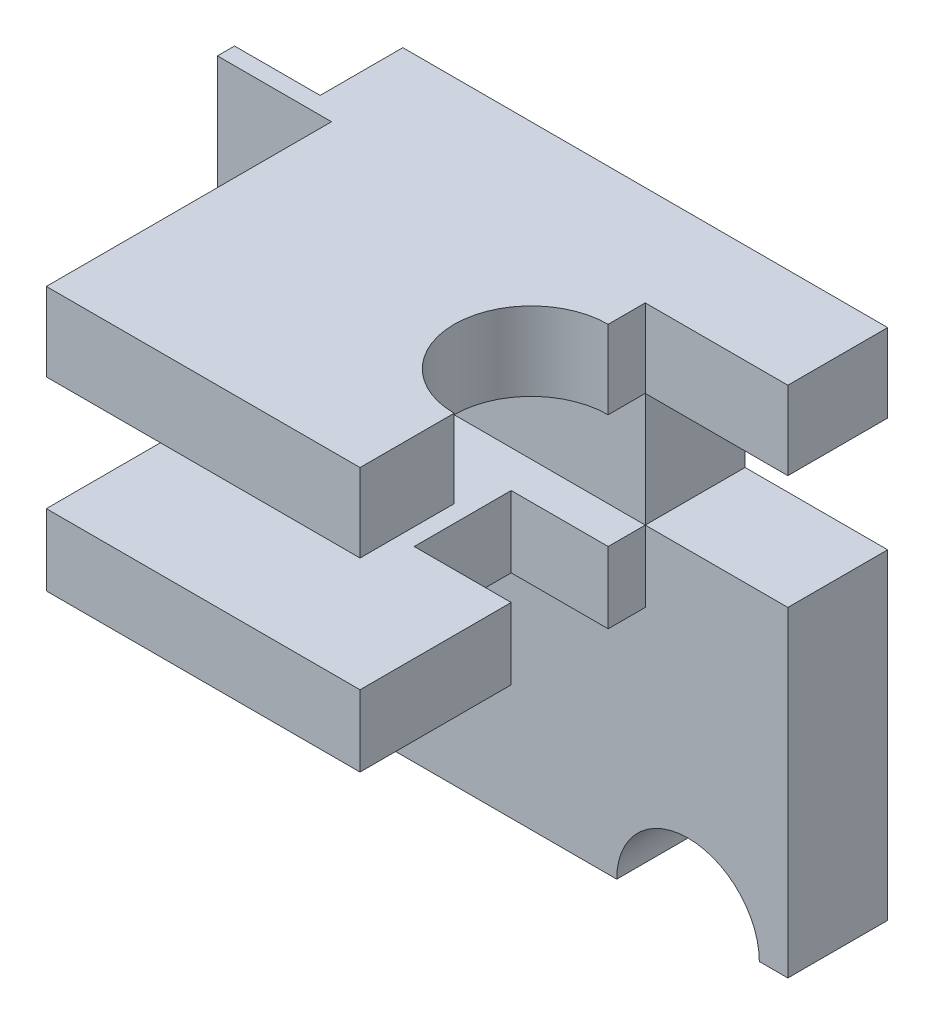
ISO-10303-21;
HEADER;
FILE_DESCRIPTION(('STEP AP214'),'2;1');
FILE_NAME('part.step','',(''),(''),'','','');
FILE_SCHEMA(('AUTOMOTIVE_DESIGN { 1 0 10303 214 1 1 1 1 }'));
ENDSEC;
DATA;
#1=APPLICATION_CONTEXT('core data for automotive mechanical design processes');
#2=APPLICATION_PROTOCOL_DEFINITION('international standard','automotive_design',2000,#1);
#3=PRODUCT_CONTEXT('',#1,'mechanical');
#4=PRODUCT('Part','Part','',(#3));
#5=PRODUCT_RELATED_PRODUCT_CATEGORY('part','',(#4));
#6=PRODUCT_DEFINITION_FORMATION('','',#4);
#7=PRODUCT_DEFINITION_CONTEXT('part definition',#1,'design');
#8=PRODUCT_DEFINITION('design','',#6,#7);
#9=PRODUCT_DEFINITION_SHAPE('','',#8);
#10=(LENGTH_UNIT() NAMED_UNIT(*) SI_UNIT(.MILLI.,.METRE.));
#11=(NAMED_UNIT(*) PLANE_ANGLE_UNIT() SI_UNIT($,.RADIAN.));
#12=(NAMED_UNIT(*) SI_UNIT($,.STERADIAN.) SOLID_ANGLE_UNIT());
#13=UNCERTAINTY_MEASURE_WITH_UNIT(LENGTH_MEASURE(1.E-05),#10,'distance_accuracy_value','');
#14=(GEOMETRIC_REPRESENTATION_CONTEXT(3) GLOBAL_UNCERTAINTY_ASSIGNED_CONTEXT((#13)) GLOBAL_UNIT_ASSIGNED_CONTEXT((#10,
#11,#12)) REPRESENTATION_CONTEXT('',''));
#15=CARTESIAN_POINT('',(0.,0.,0.));
#16=DIRECTION('',(0.,0.,1.));
#17=DIRECTION('',(1.,0.,0.));
#18=AXIS2_PLACEMENT_3D('',#15,#16,#17);
#19=CARTESIAN_POINT('',(50.,-2.47474172210313,35.));
#20=DIRECTION('',(-1.,0.,0.));
#21=DIRECTION('',(0.,0.,1.));
#22=AXIS2_PLACEMENT_3D('',#19,#20,#21);
#23=PLANE('',#22);
#24=DIRECTION('',(0.,0.,1.));
#25=VECTOR('',#24,1.);
#26=CARTESIAN_POINT('',(50.,22.5252582778969,35.));
#27=LINE('',#26,#25);
#28=CARTESIAN_POINT('',(50.,22.5252582778969,35.));
#29=VERTEX_POINT('',#28);
#30=CARTESIAN_POINT('',(50.,22.5252582778969,48.));
#31=VERTEX_POINT('',#30);
#32=EDGE_CURVE('E258',#29,#31,#27,.T.);
#33=ORIENTED_EDGE('',*,*,#32,.T.);
#34=DIRECTION('',(0.,-1.,0.));
#35=VECTOR('',#34,1.);
#36=CARTESIAN_POINT('',(50.,70.6085193985821,48.));
#37=LINE('',#36,#35);
#38=CARTESIAN_POINT('',(50.,-2.47474172210313,48.));
#39=VERTEX_POINT('',#38);
#40=EDGE_CURVE('E580',#31,#39,#37,.T.);
#41=ORIENTED_EDGE('',*,*,#40,.T.);
#42=DIRECTION('',(0.,0.,1.));
#43=VECTOR('',#42,1.);
#44=CARTESIAN_POINT('',(50.,-2.47474172210313,35.));
#45=LINE('',#44,#43);
#46=CARTESIAN_POINT('',(50.,-2.47474172210313,35.));
#47=VERTEX_POINT('',#46);
#48=EDGE_CURVE('E234',#47,#39,#45,.T.);
#49=ORIENTED_EDGE('',*,*,#48,.F.);
#50=DIRECTION('',(0.,1.,0.));
#51=VECTOR('',#50,1.);
#52=CARTESIAN_POINT('',(50.,-2.47474172210313,35.));
#53=LINE('',#52,#51);
#54=EDGE_CURVE('E276',#47,#29,#53,.T.);
#55=ORIENTED_EDGE('',*,*,#54,.T.);
#56=EDGE_LOOP('',(#33,#41,#49,#55));
#57=FACE_BOUND('',#56,.T.);
#58=ADVANCED_FACE('F39',(#57),#23,.F.);
#59=CARTESIAN_POINT('',(50.,-86.1354291952882,35.));
#60=DIRECTION('',(-1.,0.,0.));
#61=DIRECTION('',(0.,0.,1.));
#62=AXIS2_PLACEMENT_3D('',#59,#60,#61);
#63=PLANE('',#62);
#64=DIRECTION('',(0.,0.,1.));
#65=VECTOR('',#64,1.);
#66=CARTESIAN_POINT('',(50.,62.5252582778969,35.));
#67=LINE('',#66,#65);
#68=CARTESIAN_POINT('',(50.,62.5252582778969,102.));
#69=VERTEX_POINT('',#68);
#70=CARTESIAN_POINT('',(50.,62.5252582778969,135.));
#71=VERTEX_POINT('',#70);
#72=EDGE_CURVE('E289',#69,#71,#67,.T.);
#73=ORIENTED_EDGE('',*,*,#72,.F.);
#74=DIRECTION('',(0.,1.,0.));
#75=VECTOR('',#74,1.);
#76=CARTESIAN_POINT('',(50.,2.15142288540256,102.));
#77=LINE('',#76,#75);
#78=CARTESIAN_POINT('',(50.,90.,102.));
#79=VERTEX_POINT('',#78);
#80=EDGE_CURVE('E65',#69,#79,#77,.T.);
#81=ORIENTED_EDGE('',*,*,#80,.T.);
#82=DIRECTION('',(0.,0.,1.));
#83=VECTOR('',#82,1.);
#84=CARTESIAN_POINT('',(50.,90.,35.));
#85=LINE('',#84,#83);
#86=CARTESIAN_POINT('',(50.,90.,135.));
#87=VERTEX_POINT('',#86);
#88=EDGE_CURVE('E285',#79,#87,#85,.T.);
#89=ORIENTED_EDGE('',*,*,#88,.T.);
#90=DIRECTION('',(0.,1.,0.));
#91=VECTOR('',#90,1.);
#92=CARTESIAN_POINT('',(50.,-86.1354291952882,135.));
#93=LINE('',#92,#91);
#94=EDGE_CURVE('E279',#71,#87,#93,.T.);
#95=ORIENTED_EDGE('',*,*,#94,.F.);
#96=EDGE_LOOP('',(#73,#81,#89,#95));
#97=FACE_BOUND('',#96,.T.);
#98=ADVANCED_FACE('F438',(#97),#63,.F.);
#99=CARTESIAN_POINT('',(0.,0.,35.));
#100=DIRECTION('',(0.,0.,1.));
#101=DIRECTION('',(1.,0.,0.));
#102=AXIS2_PLACEMENT_3D('',#99,#100,#101);
#103=PLANE('',#102);
#104=DIRECTION('',(1.,0.,0.));
#105=VECTOR('',#104,1.);
#106=CARTESIAN_POINT('',(100.,-2.47474172210312,35.));
#107=LINE('',#106,#105);
#108=CARTESIAN_POINT('',(-60.,-2.47474172210314,35.));
#109=VERTEX_POINT('',#108);
#110=EDGE_CURVE('E235',#109,#47,#107,.T.);
#111=ORIENTED_EDGE('',*,*,#110,.F.);
#112=DIRECTION('',(0.,1.,0.));
#113=VECTOR('',#112,1.);
#114=CARTESIAN_POINT('',(-60.,-2.47474172210314,35.));
#115=LINE('',#114,#113);
#116=CARTESIAN_POINT('',(-60.,22.5252582778969,35.));
#117=VERTEX_POINT('',#116);
#118=EDGE_CURVE('E251',#109,#117,#115,.T.);
#119=ORIENTED_EDGE('',*,*,#118,.T.);
#120=DIRECTION('',(1.,0.,0.));
#121=VECTOR('',#120,1.);
#122=CARTESIAN_POINT('',(100.,22.5252582778969,35.));
#123=LINE('',#122,#121);
#124=EDGE_CURVE('E252',#117,#29,#123,.T.);
#125=ORIENTED_EDGE('',*,*,#124,.T.);
#126=DIRECTION('',(0.,-1.,0.));
#127=VECTOR('',#126,1.);
#128=CARTESIAN_POINT('',(50.,62.5252582778969,35.));
#129=LINE('',#128,#127);
#130=CARTESIAN_POINT('',(50.,62.5252582778969,35.));
#131=VERTEX_POINT('',#130);
#132=EDGE_CURVE('E368',#131,#29,#129,.T.);
#133=ORIENTED_EDGE('',*,*,#132,.F.);
#134=DIRECTION('',(-1.,0.,0.));
#135=VECTOR('',#134,1.);
#136=CARTESIAN_POINT('',(50.,62.5252582778969,35.));
#137=LINE('',#136,#135);
#138=CARTESIAN_POINT('',(-60.,62.5252582778969,35.));
#139=VERTEX_POINT('',#138);
#140=EDGE_CURVE('E295',#131,#139,#137,.T.);
#141=ORIENTED_EDGE('',*,*,#140,.T.);
#142=DIRECTION('',(0.,1.,0.));
#143=VECTOR('',#142,1.);
#144=CARTESIAN_POINT('',(-60.,-86.1354291952882,35.));
#145=LINE('',#144,#143);
#146=CARTESIAN_POINT('',(-60.,90.,35.));
#147=VERTEX_POINT('',#146);
#148=EDGE_CURVE('E299',#139,#147,#145,.T.);
#149=ORIENTED_EDGE('',*,*,#148,.T.);
#150=DIRECTION('',(1.,0.,0.));
#151=VECTOR('',#150,1.);
#152=CARTESIAN_POINT('',(-100.,90.,35.));
#153=LINE('',#152,#151);
#154=CARTESIAN_POINT('',(-100.,90.,35.));
#155=VERTEX_POINT('',#154);
#156=EDGE_CURVE('E375',#155,#147,#153,.T.);
#157=ORIENTED_EDGE('',*,*,#156,.F.);
#158=DIRECTION('',(0.,1.,0.));
#159=VECTOR('',#158,1.);
#160=CARTESIAN_POINT('',(-100.,-90.,35.));
#161=LINE('',#160,#159);
#162=CARTESIAN_POINT('',(-100.,-90.,35.));
#163=VERTEX_POINT('',#162);
#164=EDGE_CURVE('E390',#163,#155,#161,.T.);
#165=ORIENTED_EDGE('',*,*,#164,.F.);
#166=DIRECTION('',(1.,0.,0.));
#167=VECTOR('',#166,1.);
#168=CARTESIAN_POINT('',(-100.,-90.,35.));
#169=LINE('',#168,#167);
#170=CARTESIAN_POINT('',(40.,-90.,35.));
#171=VERTEX_POINT('',#170);
#172=EDGE_CURVE('E386',#163,#171,#169,.T.);
#173=ORIENTED_EDGE('',*,*,#172,.T.);
#174=CARTESIAN_POINT('',(65.,-90.,35.));
#175=DIRECTION('',(0.,0.,1.));
#176=DIRECTION('',(1.,0.,0.));
#177=AXIS2_PLACEMENT_3D('',#174,#175,#176);
#178=CIRCLE('',#177,25.);
#179=CARTESIAN_POINT('',(90.,-90.,35.));
#180=VERTEX_POINT('',#179);
#181=EDGE_CURVE('E323',#171,#180,#178,.F.);
#182=ORIENTED_EDGE('',*,*,#181,.T.);
#183=CARTESIAN_POINT('',(100.,-90.,35.));
#184=VERTEX_POINT('',#183);
#185=EDGE_CURVE('E385',#180,#184,#169,.T.);
#186=ORIENTED_EDGE('',*,*,#185,.T.);
#187=DIRECTION('',(0.,1.,0.));
#188=VECTOR('',#187,1.);
#189=CARTESIAN_POINT('',(100.,-90.,35.));
#190=LINE('',#189,#188);
#191=CARTESIAN_POINT('',(100.,22.5252582778969,35.));
#192=VERTEX_POINT('',#191);
#193=EDGE_CURVE('E381',#184,#192,#190,.T.);
#194=ORIENTED_EDGE('',*,*,#193,.T.);
#195=DIRECTION('',(-1.,0.,0.));
#196=VECTOR('',#195,1.);
#197=CARTESIAN_POINT('',(100.,22.5252582778969,35.));
#198=LINE('',#197,#196);
#199=EDGE_CURVE('E358',#192,#29,#198,.T.);
#200=ORIENTED_EDGE('',*,*,#199,.T.);
#201=ORIENTED_EDGE('',*,*,#54,.F.);
#202=EDGE_LOOP('',(#111,#119,#125,#133,#141,#149,#157,#165,#173,#182,#186,#194,#200,#201));
#203=FACE_BOUND('',#202,.T.);
#204=ADVANCED_FACE('F450',(#203),#103,.T.);
#205=CARTESIAN_POINT('',(-100.,-90.,35.));
#206=DIRECTION('',(0.,1.,0.));
#207=DIRECTION('',(0.,0.,1.));
#208=AXIS2_PLACEMENT_3D('',#205,#206,#207);
#209=PLANE('',#208);
#210=ORIENTED_EDGE('',*,*,#185,.F.);
#211=DIRECTION('',(0.,0.,-1.));
#212=VECTOR('',#211,1.);
#213=CARTESIAN_POINT('',(90.,-90.,35.));
#214=LINE('',#213,#212);
#215=CARTESIAN_POINT('',(90.,-90.,0.));
#216=VERTEX_POINT('',#215);
#217=EDGE_CURVE('E327',#180,#216,#214,.T.);
#218=ORIENTED_EDGE('',*,*,#217,.T.);
#219=DIRECTION('',(1.,0.,0.));
#220=VECTOR('',#219,1.);
#221=CARTESIAN_POINT('',(-100.,-90.,0.));
#222=LINE('',#221,#220);
#223=CARTESIAN_POINT('',(100.,-90.,0.));
#224=VERTEX_POINT('',#223);
#225=EDGE_CURVE('E401',#216,#224,#222,.T.);
#226=ORIENTED_EDGE('',*,*,#225,.T.);
#227=DIRECTION('',(0.,0.,-1.));
#228=VECTOR('',#227,1.);
#229=CARTESIAN_POINT('',(100.,-90.,35.));
#230=LINE('',#229,#228);
#231=EDGE_CURVE('E407',#184,#224,#230,.T.);
#232=ORIENTED_EDGE('',*,*,#231,.F.);
#233=EDGE_LOOP('',(#210,#218,#226,#232));
#234=FACE_BOUND('',#233,.T.);
#235=ADVANCED_FACE('F527',(#234),#209,.F.);
#236=CARTESIAN_POINT('',(100.,-90.,35.));
#237=DIRECTION('',(-1.,0.,0.));
#238=DIRECTION('',(0.,0.,1.));
#239=AXIS2_PLACEMENT_3D('',#236,#237,#238);
#240=PLANE('',#239);
#241=DIRECTION('',(0.,0.,-1.));
#242=VECTOR('',#241,1.);
#243=CARTESIAN_POINT('',(100.,62.5252582778969,35.));
#244=LINE('',#243,#242);
#245=CARTESIAN_POINT('',(100.,62.5252582778969,35.));
#246=VERTEX_POINT('',#245);
#247=CARTESIAN_POINT('',(100.,62.5252582778969,0.));
#248=VERTEX_POINT('',#247);
#249=EDGE_CURVE('E307',#246,#248,#244,.T.);
#250=ORIENTED_EDGE('',*,*,#249,.T.);
#251=DIRECTION('',(0.,1.,0.));
#252=VECTOR('',#251,1.);
#253=CARTESIAN_POINT('',(100.,-90.,0.));
#254=LINE('',#253,#252);
#255=CARTESIAN_POINT('',(100.,90.,0.));
#256=VERTEX_POINT('',#255);
#257=EDGE_CURVE('E396',#248,#256,#254,.T.);
#258=ORIENTED_EDGE('',*,*,#257,.T.);
#259=DIRECTION('',(0.,0.,-1.));
#260=VECTOR('',#259,1.);
#261=CARTESIAN_POINT('',(100.,90.,35.));
#262=LINE('',#261,#260);
#263=CARTESIAN_POINT('',(100.,90.,35.));
#264=VERTEX_POINT('',#263);
#265=EDGE_CURVE('E43',#264,#256,#262,.T.);
#266=ORIENTED_EDGE('',*,*,#265,.F.);
#267=EDGE_CURVE('E379',#246,#264,#190,.T.);
#268=ORIENTED_EDGE('',*,*,#267,.F.);
#269=EDGE_LOOP('',(#250,#258,#266,#268));
#270=FACE_BOUND('',#269,.T.);
#271=ADVANCED_FACE('F427',(#270),#240,.F.);
#272=DIRECTION('',(0.,1.,0.));
#273=VECTOR('',#272,1.);
#274=CARTESIAN_POINT('',(50.,-86.1354291952882,35.));
#275=LINE('',#274,#273);
#276=CARTESIAN_POINT('',(50.,90.,35.));
#277=VERTEX_POINT('',#276);
#278=EDGE_CURVE('E317',#131,#277,#275,.T.);
#279=ORIENTED_EDGE('',*,*,#278,.F.);
#280=DIRECTION('',(-1.,0.,0.));
#281=VECTOR('',#280,1.);
#282=CARTESIAN_POINT('',(100.,62.5252582778969,35.));
#283=LINE('',#282,#281);
#284=EDGE_CURVE('E343',#246,#131,#283,.T.);
#285=ORIENTED_EDGE('',*,*,#284,.F.);
#286=ORIENTED_EDGE('',*,*,#267,.T.);
#287=EDGE_CURVE('E380',#277,#264,#153,.T.);
#288=ORIENTED_EDGE('',*,*,#287,.F.);
#289=EDGE_LOOP('',(#279,#285,#286,#288));
#290=FACE_BOUND('',#289,.T.);
#291=ADVANCED_FACE('F459',(#290),#103,.T.);
#292=CARTESIAN_POINT('',(0.,0.,0.));
#293=DIRECTION('',(0.,0.,1.));
#294=DIRECTION('',(1.,0.,0.));
#295=AXIS2_PLACEMENT_3D('',#292,#293,#294);
#296=PLANE('',#295);
#297=CARTESIAN_POINT('',(-70.,-90.,0.));
#298=VERTEX_POINT('',#297);
#299=CARTESIAN_POINT('',(40.,-90.,0.));
#300=VERTEX_POINT('',#299);
#301=EDGE_CURVE('E402',#298,#300,#222,.T.);
#302=ORIENTED_EDGE('',*,*,#301,.F.);
#303=DIRECTION('',(0.,1.,0.));
#304=VECTOR('',#303,1.);
#305=CARTESIAN_POINT('',(-70.,-90.,0.));
#306=LINE('',#305,#304);
#307=CARTESIAN_POINT('',(-70.,90.,0.));
#308=VERTEX_POINT('',#307);
#309=EDGE_CURVE('E257',#298,#308,#306,.T.);
#310=ORIENTED_EDGE('',*,*,#309,.T.);
#311=DIRECTION('',(1.,0.,0.));
#312=VECTOR('',#311,1.);
#313=CARTESIAN_POINT('',(-100.,90.,0.));
#314=LINE('',#313,#312);
#315=EDGE_CURVE('E339',#308,#256,#314,.T.);
#316=ORIENTED_EDGE('',*,*,#315,.T.);
#317=ORIENTED_EDGE('',*,*,#257,.F.);
#318=DIRECTION('',(-1.,0.,0.));
#319=VECTOR('',#318,1.);
#320=CARTESIAN_POINT('',(100.,62.5252582778969,0.));
#321=LINE('',#320,#319);
#322=CARTESIAN_POINT('',(50.,62.5252582778969,0.));
#323=VERTEX_POINT('',#322);
#324=EDGE_CURVE('E353',#248,#323,#321,.T.);
#325=ORIENTED_EDGE('',*,*,#324,.T.);
#326=DIRECTION('',(0.,-1.,0.));
#327=VECTOR('',#326,1.);
#328=CARTESIAN_POINT('',(50.,62.5252582778969,0.));
#329=LINE('',#328,#327);
#330=CARTESIAN_POINT('',(50.,22.5252582778969,0.));
#331=VERTEX_POINT('',#330);
#332=EDGE_CURVE('E357',#323,#331,#329,.T.);
#333=ORIENTED_EDGE('',*,*,#332,.T.);
#334=DIRECTION('',(-1.,0.,0.));
#335=VECTOR('',#334,1.);
#336=CARTESIAN_POINT('',(100.,22.5252582778969,0.));
#337=LINE('',#336,#335);
#338=CARTESIAN_POINT('',(100.,22.5252582778968,0.));
#339=VERTEX_POINT('',#338);
#340=EDGE_CURVE('E331',#339,#331,#337,.T.);
#341=ORIENTED_EDGE('',*,*,#340,.F.);
#342=EDGE_CURVE('E397',#224,#339,#254,.T.);
#343=ORIENTED_EDGE('',*,*,#342,.F.);
#344=ORIENTED_EDGE('',*,*,#225,.F.);
#345=CARTESIAN_POINT('',(65.,-90.,0.));
#346=DIRECTION('',(0.,0.,1.));
#347=DIRECTION('',(1.,0.,0.));
#348=AXIS2_PLACEMENT_3D('',#345,#346,#347);
#349=CIRCLE('',#348,25.);
#350=EDGE_CURVE('E328',#300,#216,#349,.F.);
#351=ORIENTED_EDGE('',*,*,#350,.F.);
#352=EDGE_LOOP('',(#302,#310,#316,#317,#325,#333,#341,#343,#344,#351));
#353=FACE_BOUND('',#352,.T.);
#354=ADVANCED_FACE('F470',(#353),#296,.F.);
#355=CARTESIAN_POINT('',(-100.,90.,35.));
#356=DIRECTION('',(0.,1.,0.));
#357=DIRECTION('',(0.,0.,1.));
#358=AXIS2_PLACEMENT_3D('',#355,#356,#357);
#359=PLANE('',#358);
#360=CARTESIAN_POINT('',(50.,90.,75.));
#361=DIRECTION('',(0.,1.,0.));
#362=DIRECTION('',(0.,0.,1.));
#363=AXIS2_PLACEMENT_3D('',#360,#361,#362);
#364=CIRCLE('',#363,27.);
#365=CARTESIAN_POINT('',(50.,90.,48.));
#366=VERTEX_POINT('',#365);
#367=EDGE_CURVE('E591',#366,#79,#364,.T.);
#368=ORIENTED_EDGE('',*,*,#367,.F.);
#369=EDGE_CURVE('E280',#277,#366,#85,.T.);
#370=ORIENTED_EDGE('',*,*,#369,.F.);
#371=ORIENTED_EDGE('',*,*,#287,.T.);
#372=ORIENTED_EDGE('',*,*,#265,.T.);
#373=ORIENTED_EDGE('',*,*,#315,.F.);
#374=DIRECTION('',(0.,0.,-1.));
#375=VECTOR('',#374,1.);
#376=CARTESIAN_POINT('',(-70.,90.,0.));
#377=LINE('',#376,#375);
#378=CARTESIAN_POINT('',(-70.,90.,29.));
#379=VERTEX_POINT('',#378);
#380=EDGE_CURVE('E605',#379,#308,#377,.T.);
#381=ORIENTED_EDGE('',*,*,#380,.F.);
#382=DIRECTION('',(1.,0.,0.));
#383=VECTOR('',#382,1.);
#384=CARTESIAN_POINT('',(-100.,90.,29.));
#385=LINE('',#384,#383);
#386=CARTESIAN_POINT('',(-100.,90.,29.));
#387=VERTEX_POINT('',#386);
#388=EDGE_CURVE('E602',#387,#379,#385,.T.);
#389=ORIENTED_EDGE('',*,*,#388,.F.);
#390=DIRECTION('',(0.,0.,-1.));
#391=VECTOR('',#390,1.);
#392=CARTESIAN_POINT('',(-100.,90.,35.));
#393=LINE('',#392,#391);
#394=EDGE_CURVE('E11',#155,#387,#393,.T.);
#395=ORIENTED_EDGE('',*,*,#394,.F.);
#396=ORIENTED_EDGE('',*,*,#156,.T.);
#397=DIRECTION('',(0.,0.,1.));
#398=VECTOR('',#397,1.);
#399=CARTESIAN_POINT('',(-60.,90.,35.));
#400=LINE('',#399,#398);
#401=CARTESIAN_POINT('',(-60.,90.,135.));
#402=VERTEX_POINT('',#401);
#403=EDGE_CURVE('E284',#147,#402,#400,.T.);
#404=ORIENTED_EDGE('',*,*,#403,.T.);
#405=DIRECTION('',(-1.,0.,0.));
#406=VECTOR('',#405,1.);
#407=CARTESIAN_POINT('',(50.,90.,135.));
#408=LINE('',#407,#406);
#409=EDGE_CURVE('E290',#87,#402,#408,.T.);
#410=ORIENTED_EDGE('',*,*,#409,.F.);
#411=ORIENTED_EDGE('',*,*,#88,.F.);
#412=EDGE_LOOP('',(#368,#370,#371,#372,#373,#381,#389,#395,#396,#404,#410,#411));
#413=FACE_BOUND('',#412,.T.);
#414=ADVANCED_FACE('F41',(#413),#359,.T.);
#415=CARTESIAN_POINT('',(-100.,-90.,35.));
#416=DIRECTION('',(-1.,0.,0.));
#417=DIRECTION('',(0.,0.,1.));
#418=AXIS2_PLACEMENT_3D('',#415,#416,#417);
#419=PLANE('',#418);
#420=DIRECTION('',(0.,1.,0.));
#421=VECTOR('',#420,1.);
#422=CARTESIAN_POINT('',(-100.,-90.,29.));
#423=LINE('',#422,#421);
#424=CARTESIAN_POINT('',(-100.,-90.,29.));
#425=VERTEX_POINT('',#424);
#426=EDGE_CURVE('E542',#425,#387,#423,.T.);
#427=ORIENTED_EDGE('',*,*,#426,.F.);
#428=DIRECTION('',(0.,0.,-1.));
#429=VECTOR('',#428,1.);
#430=CARTESIAN_POINT('',(-100.,-90.,35.));
#431=LINE('',#430,#429);
#432=EDGE_CURVE('E49',#163,#425,#431,.T.);
#433=ORIENTED_EDGE('',*,*,#432,.F.);
#434=ORIENTED_EDGE('',*,*,#164,.T.);
#435=ORIENTED_EDGE('',*,*,#394,.T.);
#436=EDGE_LOOP('',(#427,#433,#434,#435));
#437=FACE_BOUND('',#436,.T.);
#438=ADVANCED_FACE('F479',(#437),#419,.T.);
#439=DIRECTION('',(1.,0.,0.));
#440=VECTOR('',#439,1.);
#441=CARTESIAN_POINT('',(-100.,-90.,29.));
#442=LINE('',#441,#440);
#443=CARTESIAN_POINT('',(-70.,-90.,29.));
#444=VERTEX_POINT('',#443);
#445=EDGE_CURVE('E552',#425,#444,#442,.T.);
#446=ORIENTED_EDGE('',*,*,#445,.T.);
#447=DIRECTION('',(0.,0.,-1.));
#448=VECTOR('',#447,1.);
#449=CARTESIAN_POINT('',(-70.,-90.,0.));
#450=LINE('',#449,#448);
#451=EDGE_CURVE('E549',#444,#298,#450,.T.);
#452=ORIENTED_EDGE('',*,*,#451,.T.);
#453=ORIENTED_EDGE('',*,*,#301,.T.);
#454=DIRECTION('',(0.,0.,-1.));
#455=VECTOR('',#454,1.);
#456=CARTESIAN_POINT('',(40.,-90.,35.));
#457=LINE('',#456,#455);
#458=EDGE_CURVE('E335',#171,#300,#457,.T.);
#459=ORIENTED_EDGE('',*,*,#458,.F.);
#460=ORIENTED_EDGE('',*,*,#172,.F.);
#461=ORIENTED_EDGE('',*,*,#432,.T.);
#462=EDGE_LOOP('',(#446,#452,#453,#459,#460,#461));
#463=FACE_BOUND('',#462,.T.);
#464=ADVANCED_FACE('F521',(#463),#209,.F.);
#465=ORIENTED_EDGE('',*,*,#342,.T.);
#466=DIRECTION('',(0.,0.,-1.));
#467=VECTOR('',#466,1.);
#468=CARTESIAN_POINT('',(100.,22.5252582778969,35.));
#469=LINE('',#468,#467);
#470=EDGE_CURVE('E340',#192,#339,#469,.T.);
#471=ORIENTED_EDGE('',*,*,#470,.F.);
#472=ORIENTED_EDGE('',*,*,#193,.F.);
#473=ORIENTED_EDGE('',*,*,#231,.T.);
#474=EDGE_LOOP('',(#465,#471,#472,#473));
#475=FACE_BOUND('',#474,.T.);
#476=ADVANCED_FACE('F517',(#475),#240,.F.);
#477=CARTESIAN_POINT('',(100.,62.5252582778969,35.));
#478=DIRECTION('',(0.,-1.,0.));
#479=DIRECTION('',(0.,0.,-1.));
#480=AXIS2_PLACEMENT_3D('',#477,#478,#479);
#481=PLANE('',#480);
#482=ORIENTED_EDGE('',*,*,#324,.F.);
#483=ORIENTED_EDGE('',*,*,#249,.F.);
#484=ORIENTED_EDGE('',*,*,#284,.T.);
#485=DIRECTION('',(0.,0.,-1.));
#486=VECTOR('',#485,1.);
#487=CARTESIAN_POINT('',(50.,62.5252582778969,35.));
#488=LINE('',#487,#486);
#489=EDGE_CURVE('E347',#131,#323,#488,.T.);
#490=ORIENTED_EDGE('',*,*,#489,.T.);
#491=EDGE_LOOP('',(#482,#483,#484,#490));
#492=FACE_BOUND('',#491,.T.);
#493=ADVANCED_FACE('F463',(#492),#481,.T.);
#494=CARTESIAN_POINT('',(50.,62.5252582778969,35.));
#495=DIRECTION('',(1.,0.,0.));
#496=DIRECTION('',(0.,1.,0.));
#497=AXIS2_PLACEMENT_3D('',#494,#495,#496);
#498=PLANE('',#497);
#499=ORIENTED_EDGE('',*,*,#332,.F.);
#500=ORIENTED_EDGE('',*,*,#489,.F.);
#501=ORIENTED_EDGE('',*,*,#132,.T.);
#502=DIRECTION('',(0.,0.,-1.));
#503=VECTOR('',#502,1.);
#504=CARTESIAN_POINT('',(50.,22.5252582778969,35.));
#505=LINE('',#504,#503);
#506=EDGE_CURVE('E344',#29,#331,#505,.T.);
#507=ORIENTED_EDGE('',*,*,#506,.T.);
#508=EDGE_LOOP('',(#499,#500,#501,#507));
#509=FACE_BOUND('',#508,.T.);
#510=ADVANCED_FACE('F466',(#509),#498,.T.);
#511=CARTESIAN_POINT('',(100.,22.5252582778969,35.));
#512=DIRECTION('',(0.,-1.,0.));
#513=DIRECTION('',(1.,0.,0.));
#514=AXIS2_PLACEMENT_3D('',#511,#512,#513);
#515=PLANE('',#514);
#516=ORIENTED_EDGE('',*,*,#340,.T.);
#517=ORIENTED_EDGE('',*,*,#506,.F.);
#518=ORIENTED_EDGE('',*,*,#199,.F.);
#519=ORIENTED_EDGE('',*,*,#470,.T.);
#520=EDGE_LOOP('',(#516,#517,#518,#519));
#521=FACE_BOUND('',#520,.T.);
#522=ADVANCED_FACE('F509',(#521),#515,.F.);
#523=CARTESIAN_POINT('',(65.,-90.,35.));
#524=DIRECTION('',(0.,0.,-1.));
#525=DIRECTION('',(-1.,0.,0.));
#526=AXIS2_PLACEMENT_3D('',#523,#524,#525);
#527=CYLINDRICAL_SURFACE('',#526,25.);
#528=ORIENTED_EDGE('',*,*,#350,.T.);
#529=ORIENTED_EDGE('',*,*,#217,.F.);
#530=ORIENTED_EDGE('',*,*,#181,.F.);
#531=ORIENTED_EDGE('',*,*,#458,.T.);
#532=EDGE_LOOP('',(#528,#529,#530,#531));
#533=FACE_BOUND('',#532,.T.);
#534=ADVANCED_FACE('F506',(#533),#527,.F.);
#535=CARTESIAN_POINT('',(50.,-86.1354291952882,135.));
#536=DIRECTION('',(0.,0.,-1.));
#537=DIRECTION('',(-1.,0.,0.));
#538=AXIS2_PLACEMENT_3D('',#535,#536,#537);
#539=PLANE('',#538);
#540=DIRECTION('',(-1.,0.,0.));
#541=VECTOR('',#540,1.);
#542=CARTESIAN_POINT('',(50.,62.5252582778969,135.));
#543=LINE('',#542,#541);
#544=CARTESIAN_POINT('',(-60.,62.5252582778969,135.));
#545=VERTEX_POINT('',#544);
#546=EDGE_CURVE('E303',#71,#545,#543,.T.);
#547=ORIENTED_EDGE('',*,*,#546,.F.);
#548=ORIENTED_EDGE('',*,*,#94,.T.);
#549=ORIENTED_EDGE('',*,*,#409,.T.);
#550=DIRECTION('',(0.,1.,0.));
#551=VECTOR('',#550,1.);
#552=CARTESIAN_POINT('',(-60.,-86.1354291952882,135.));
#553=LINE('',#552,#551);
#554=EDGE_CURVE('E300',#545,#402,#553,.T.);
#555=ORIENTED_EDGE('',*,*,#554,.F.);
#556=EDGE_LOOP('',(#547,#548,#549,#555));
#557=FACE_BOUND('',#556,.T.);
#558=ADVANCED_FACE('F442',(#557),#539,.F.);
#559=CARTESIAN_POINT('',(-60.,-86.1354291952882,35.));
#560=DIRECTION('',(-1.,0.,0.));
#561=DIRECTION('',(0.,0.,1.));
#562=AXIS2_PLACEMENT_3D('',#559,#560,#561);
#563=PLANE('',#562);
#564=ORIENTED_EDGE('',*,*,#148,.F.);
#565=DIRECTION('',(0.,0.,1.));
#566=VECTOR('',#565,1.);
#567=CARTESIAN_POINT('',(-60.,62.5252582778969,35.));
#568=LINE('',#567,#566);
#569=EDGE_CURVE('E294',#139,#545,#568,.T.);
#570=ORIENTED_EDGE('',*,*,#569,.T.);
#571=ORIENTED_EDGE('',*,*,#554,.T.);
#572=ORIENTED_EDGE('',*,*,#403,.F.);
#573=EDGE_LOOP('',(#564,#570,#571,#572));
#574=FACE_BOUND('',#573,.T.);
#575=ADVANCED_FACE('F446',(#574),#563,.T.);
#576=ORIENTED_EDGE('',*,*,#369,.T.);
#577=DIRECTION('',(0.,1.,0.));
#578=VECTOR('',#577,1.);
#579=CARTESIAN_POINT('',(50.,2.15142288540256,48.));
#580=LINE('',#579,#578);
#581=CARTESIAN_POINT('',(50.,62.5252582778969,48.));
#582=VERTEX_POINT('',#581);
#583=EDGE_CURVE('E594',#582,#366,#580,.T.);
#584=ORIENTED_EDGE('',*,*,#583,.F.);
#585=EDGE_CURVE('E308',#131,#582,#67,.T.);
#586=ORIENTED_EDGE('',*,*,#585,.F.);
#587=ORIENTED_EDGE('',*,*,#278,.T.);
#588=EDGE_LOOP('',(#576,#584,#586,#587));
#589=FACE_BOUND('',#588,.T.);
#590=ADVANCED_FACE('F489',(#589),#63,.F.);
#591=CARTESIAN_POINT('',(100.,62.5252582778969,35.));
#592=DIRECTION('',(0.,-1.,0.));
#593=DIRECTION('',(0.,0.,-1.));
#594=AXIS2_PLACEMENT_3D('',#591,#592,#593);
#595=PLANE('',#594);
#596=CARTESIAN_POINT('',(50.,62.5252582778969,75.));
#597=DIRECTION('',(0.,-1.,0.));
#598=DIRECTION('',(0.,0.,-1.));
#599=AXIS2_PLACEMENT_3D('',#596,#597,#598);
#600=CIRCLE('',#599,27.);
#601=EDGE_CURVE('E595',#582,#69,#600,.F.);
#602=ORIENTED_EDGE('',*,*,#601,.T.);
#603=ORIENTED_EDGE('',*,*,#72,.T.);
#604=ORIENTED_EDGE('',*,*,#546,.T.);
#605=ORIENTED_EDGE('',*,*,#569,.F.);
#606=ORIENTED_EDGE('',*,*,#140,.F.);
#607=ORIENTED_EDGE('',*,*,#585,.T.);
#608=EDGE_LOOP('',(#602,#603,#604,#605,#606,#607));
#609=FACE_BOUND('',#608,.T.);
#610=ADVANCED_FACE('F456',(#609),#595,.T.);
#611=CARTESIAN_POINT('',(50.,-2.47474172210313,82.));
#612=VERTEX_POINT('',#611);
#613=CARTESIAN_POINT('',(50.,-2.47474172210313,135.));
#614=VERTEX_POINT('',#613);
#615=EDGE_CURVE('E223',#612,#614,#45,.T.);
#616=ORIENTED_EDGE('',*,*,#615,.F.);
#617=DIRECTION('',(0.,-1.,0.));
#618=VECTOR('',#617,1.);
#619=CARTESIAN_POINT('',(50.,70.6085193985821,82.));
#620=LINE('',#619,#618);
#621=CARTESIAN_POINT('',(50.,22.5252582778969,82.));
#622=VERTEX_POINT('',#621);
#623=EDGE_CURVE('E207',#622,#612,#620,.T.);
#624=ORIENTED_EDGE('',*,*,#623,.F.);
#625=CARTESIAN_POINT('',(50.,22.5252582778969,135.));
#626=VERTEX_POINT('',#625);
#627=EDGE_CURVE('E256',#622,#626,#27,.T.);
#628=ORIENTED_EDGE('',*,*,#627,.T.);
#629=DIRECTION('',(0.,1.,0.));
#630=VECTOR('',#629,1.);
#631=CARTESIAN_POINT('',(50.,-2.47474172210313,135.));
#632=LINE('',#631,#630);
#633=EDGE_CURVE('E231',#614,#626,#632,.T.);
#634=ORIENTED_EDGE('',*,*,#633,.F.);
#635=EDGE_LOOP('',(#616,#624,#628,#634));
#636=FACE_BOUND('',#635,.T.);
#637=ADVANCED_FACE('F229',(#636),#23,.F.);
#638=CARTESIAN_POINT('',(100.,-2.47474172210312,135.));
#639=DIRECTION('',(0.,0.,-1.));
#640=DIRECTION('',(-1.,0.,0.));
#641=AXIS2_PLACEMENT_3D('',#638,#639,#640);
#642=PLANE('',#641);
#643=DIRECTION('',(-1.,0.,0.));
#644=VECTOR('',#643,1.);
#645=CARTESIAN_POINT('',(100.,22.5252582778969,135.));
#646=LINE('',#645,#644);
#647=CARTESIAN_POINT('',(-60.,22.5252582778969,135.));
#648=VERTEX_POINT('',#647);
#649=EDGE_CURVE('E262',#626,#648,#646,.T.);
#650=ORIENTED_EDGE('',*,*,#649,.T.);
#651=DIRECTION('',(0.,1.,0.));
#652=VECTOR('',#651,1.);
#653=CARTESIAN_POINT('',(-60.,-2.47474172210314,135.));
#654=LINE('',#653,#652);
#655=CARTESIAN_POINT('',(-60.,-2.47474172210314,135.));
#656=VERTEX_POINT('',#655);
#657=EDGE_CURVE('E270',#656,#648,#654,.T.);
#658=ORIENTED_EDGE('',*,*,#657,.F.);
#659=DIRECTION('',(-1.,0.,0.));
#660=VECTOR('',#659,1.);
#661=CARTESIAN_POINT('',(100.,-2.47474172210312,135.));
#662=LINE('',#661,#660);
#663=EDGE_CURVE('E240',#614,#656,#662,.T.);
#664=ORIENTED_EDGE('',*,*,#663,.F.);
#665=ORIENTED_EDGE('',*,*,#633,.T.);
#666=EDGE_LOOP('',(#650,#658,#664,#665));
#667=FACE_BOUND('',#666,.T.);
#668=ADVANCED_FACE('F492',(#667),#642,.F.);
#669=CARTESIAN_POINT('',(-60.,-2.47474172210314,35.));
#670=DIRECTION('',(1.,0.,0.));
#671=DIRECTION('',(0.,0.,-1.));
#672=AXIS2_PLACEMENT_3D('',#669,#670,#671);
#673=PLANE('',#672);
#674=DIRECTION('',(0.,0.,-1.));
#675=VECTOR('',#674,1.);
#676=CARTESIAN_POINT('',(-60.,22.5252582778969,35.));
#677=LINE('',#676,#675);
#678=EDGE_CURVE('E242',#648,#117,#677,.T.);
#679=ORIENTED_EDGE('',*,*,#678,.T.);
#680=ORIENTED_EDGE('',*,*,#118,.F.);
#681=DIRECTION('',(0.,0.,-1.));
#682=VECTOR('',#681,1.);
#683=CARTESIAN_POINT('',(-60.,-2.47474172210314,35.));
#684=LINE('',#683,#682);
#685=EDGE_CURVE('E248',#656,#109,#684,.T.);
#686=ORIENTED_EDGE('',*,*,#685,.F.);
#687=ORIENTED_EDGE('',*,*,#657,.T.);
#688=EDGE_LOOP('',(#679,#680,#686,#687));
#689=FACE_BOUND('',#688,.T.);
#690=ADVANCED_FACE('F497',(#689),#673,.F.);
#691=CARTESIAN_POINT('',(0.,-2.47474172210314,0.));
#692=DIRECTION('',(0.,-1.,0.));
#693=DIRECTION('',(1.,0.,0.));
#694=AXIS2_PLACEMENT_3D('',#691,#692,#693);
#695=PLANE('',#694);
#696=DIRECTION('',(1.,0.,0.));
#697=VECTOR('',#696,1.);
#698=CARTESIAN_POINT('',(50.,-2.47474172210313,48.));
#699=LINE('',#698,#697);
#700=CARTESIAN_POINT('',(16.,-2.47474172210313,48.));
#701=VERTEX_POINT('',#700);
#702=EDGE_CURVE('E218',#701,#39,#699,.T.);
#703=ORIENTED_EDGE('',*,*,#702,.F.);
#704=DIRECTION('',(0.,0.,-1.));
#705=VECTOR('',#704,1.);
#706=CARTESIAN_POINT('',(16.,-2.47474172210313,48.));
#707=LINE('',#706,#705);
#708=CARTESIAN_POINT('',(16.,-2.47474172210313,82.));
#709=VERTEX_POINT('',#708);
#710=EDGE_CURVE('E226',#709,#701,#707,.T.);
#711=ORIENTED_EDGE('',*,*,#710,.F.);
#712=DIRECTION('',(-1.,0.,0.));
#713=VECTOR('',#712,1.);
#714=CARTESIAN_POINT('',(50.,-2.47474172210313,82.));
#715=LINE('',#714,#713);
#716=EDGE_CURVE('E210',#612,#709,#715,.T.);
#717=ORIENTED_EDGE('',*,*,#716,.F.);
#718=ORIENTED_EDGE('',*,*,#615,.T.);
#719=ORIENTED_EDGE('',*,*,#663,.T.);
#720=ORIENTED_EDGE('',*,*,#685,.T.);
#721=ORIENTED_EDGE('',*,*,#110,.T.);
#722=ORIENTED_EDGE('',*,*,#48,.T.);
#723=EDGE_LOOP('',(#703,#711,#717,#718,#719,#720,#721,#722));
#724=FACE_BOUND('',#723,.T.);
#725=ADVANCED_FACE('F222',(#724),#695,.T.);
#726=CARTESIAN_POINT('',(0.,22.5252582778969,0.));
#727=DIRECTION('',(0.,-1.,0.));
#728=DIRECTION('',(1.,0.,0.));
#729=AXIS2_PLACEMENT_3D('',#726,#727,#728);
#730=PLANE('',#729);
#731=DIRECTION('',(0.,0.,1.));
#732=VECTOR('',#731,1.);
#733=CARTESIAN_POINT('',(16.,22.5252582778969,48.));
#734=LINE('',#733,#732);
#735=CARTESIAN_POINT('',(16.,22.5252582778969,48.));
#736=VERTEX_POINT('',#735);
#737=CARTESIAN_POINT('',(16.,22.5252582778969,82.));
#738=VERTEX_POINT('',#737);
#739=EDGE_CURVE('E583',#736,#738,#734,.T.);
#740=ORIENTED_EDGE('',*,*,#739,.F.);
#741=DIRECTION('',(-1.,0.,0.));
#742=VECTOR('',#741,1.);
#743=CARTESIAN_POINT('',(50.,22.5252582778969,48.));
#744=LINE('',#743,#742);
#745=EDGE_CURVE('E568',#31,#736,#744,.T.);
#746=ORIENTED_EDGE('',*,*,#745,.F.);
#747=ORIENTED_EDGE('',*,*,#32,.F.);
#748=ORIENTED_EDGE('',*,*,#124,.F.);
#749=ORIENTED_EDGE('',*,*,#678,.F.);
#750=ORIENTED_EDGE('',*,*,#649,.F.);
#751=ORIENTED_EDGE('',*,*,#627,.F.);
#752=DIRECTION('',(1.,0.,0.));
#753=VECTOR('',#752,1.);
#754=CARTESIAN_POINT('',(50.,22.5252582778969,82.));
#755=LINE('',#754,#753);
#756=EDGE_CURVE('E213',#738,#622,#755,.T.);
#757=ORIENTED_EDGE('',*,*,#756,.F.);
#758=EDGE_LOOP('',(#740,#746,#747,#748,#749,#750,#751,#757));
#759=FACE_BOUND('',#758,.T.);
#760=ADVANCED_FACE('F566',(#759),#730,.F.);
#761=CARTESIAN_POINT('',(-70.,-90.,0.));
#762=DIRECTION('',(1.,0.,0.));
#763=DIRECTION('',(0.,0.,-1.));
#764=AXIS2_PLACEMENT_3D('',#761,#762,#763);
#765=PLANE('',#764);
#766=ORIENTED_EDGE('',*,*,#380,.T.);
#767=ORIENTED_EDGE('',*,*,#309,.F.);
#768=ORIENTED_EDGE('',*,*,#451,.F.);
#769=DIRECTION('',(0.,1.,0.));
#770=VECTOR('',#769,1.);
#771=CARTESIAN_POINT('',(-70.,-90.,29.));
#772=LINE('',#771,#770);
#773=EDGE_CURVE('E548',#444,#379,#772,.T.);
#774=ORIENTED_EDGE('',*,*,#773,.T.);
#775=EDGE_LOOP('',(#766,#767,#768,#774));
#776=FACE_BOUND('',#775,.T.);
#777=ADVANCED_FACE('F617',(#776),#765,.F.);
#778=CARTESIAN_POINT('',(-100.,-90.,29.));
#779=DIRECTION('',(0.,0.,1.));
#780=DIRECTION('',(1.,0.,0.));
#781=AXIS2_PLACEMENT_3D('',#778,#779,#780);
#782=PLANE('',#781);
#783=ORIENTED_EDGE('',*,*,#388,.T.);
#784=ORIENTED_EDGE('',*,*,#773,.F.);
#785=ORIENTED_EDGE('',*,*,#445,.F.);
#786=ORIENTED_EDGE('',*,*,#426,.T.);
#787=EDGE_LOOP('',(#783,#784,#785,#786));
#788=FACE_BOUND('',#787,.T.);
#789=ADVANCED_FACE('F618',(#788),#782,.F.);
#790=CARTESIAN_POINT('',(50.,2.15142288540256,75.));
#791=DIRECTION('',(0.,1.,0.));
#792=DIRECTION('',(0.,0.,1.));
#793=AXIS2_PLACEMENT_3D('',#790,#791,#792);
#794=CYLINDRICAL_SURFACE('',#793,27.);
#795=ORIENTED_EDGE('',*,*,#583,.T.);
#796=ORIENTED_EDGE('',*,*,#367,.T.);
#797=ORIENTED_EDGE('',*,*,#80,.F.);
#798=ORIENTED_EDGE('',*,*,#601,.F.);
#799=EDGE_LOOP('',(#795,#796,#797,#798));
#800=FACE_BOUND('',#799,.T.);
#801=ADVANCED_FACE('F620',(#800),#794,.F.);
#802=CARTESIAN_POINT('',(50.,70.6085193985821,48.));
#803=DIRECTION('',(0.,0.,-1.));
#804=DIRECTION('',(-1.,0.,0.));
#805=AXIS2_PLACEMENT_3D('',#802,#803,#804);
#806=PLANE('',#805);
#807=ORIENTED_EDGE('',*,*,#745,.T.);
#808=DIRECTION('',(0.,-1.,0.));
#809=VECTOR('',#808,1.);
#810=CARTESIAN_POINT('',(16.,70.6085193985821,48.));
#811=LINE('',#810,#809);
#812=EDGE_CURVE('E584',#736,#701,#811,.T.);
#813=ORIENTED_EDGE('',*,*,#812,.T.);
#814=ORIENTED_EDGE('',*,*,#702,.T.);
#815=ORIENTED_EDGE('',*,*,#40,.F.);
#816=EDGE_LOOP('',(#807,#813,#814,#815));
#817=FACE_BOUND('',#816,.T.);
#818=ADVANCED_FACE('F626',(#817),#806,.F.);
#819=CARTESIAN_POINT('',(16.,70.6085193985821,48.));
#820=DIRECTION('',(-1.,0.,0.));
#821=DIRECTION('',(0.,-1.,0.));
#822=AXIS2_PLACEMENT_3D('',#819,#820,#821);
#823=PLANE('',#822);
#824=ORIENTED_EDGE('',*,*,#739,.T.);
#825=DIRECTION('',(0.,-1.,0.));
#826=VECTOR('',#825,1.);
#827=CARTESIAN_POINT('',(16.,70.6085193985821,82.));
#828=LINE('',#827,#826);
#829=EDGE_CURVE('E57',#738,#709,#828,.T.);
#830=ORIENTED_EDGE('',*,*,#829,.T.);
#831=ORIENTED_EDGE('',*,*,#710,.T.);
#832=ORIENTED_EDGE('',*,*,#812,.F.);
#833=EDGE_LOOP('',(#824,#830,#831,#832));
#834=FACE_BOUND('',#833,.T.);
#835=ADVANCED_FACE('F787',(#834),#823,.F.);
#836=CARTESIAN_POINT('',(50.,70.6085193985821,82.));
#837=DIRECTION('',(0.,0.,1.));
#838=DIRECTION('',(1.,0.,0.));
#839=AXIS2_PLACEMENT_3D('',#836,#837,#838);
#840=PLANE('',#839);
#841=ORIENTED_EDGE('',*,*,#756,.T.);
#842=ORIENTED_EDGE('',*,*,#623,.T.);
#843=ORIENTED_EDGE('',*,*,#716,.T.);
#844=ORIENTED_EDGE('',*,*,#829,.F.);
#845=EDGE_LOOP('',(#841,#842,#843,#844));
#846=FACE_BOUND('',#845,.T.);
#847=ADVANCED_FACE('F209',(#846),#840,.F.);
#848=CLOSED_SHELL('',(#58,#98,#204,#235,#271,#291,#354,#414,#438,#464,#476,#493,#510,#522,#534,
#558,#575,#590,#610,#637,#668,#690,#725,#760,#777,#789,#801,#818,#835,#847));
#849=MANIFOLD_SOLID_BREP('B2',#848);
#850=ADVANCED_BREP_SHAPE_REPRESENTATION('',(#18,#849),#14);
#851=SHAPE_DEFINITION_REPRESENTATION(#9,#850);
ENDSEC;
END-ISO-10303-21;
